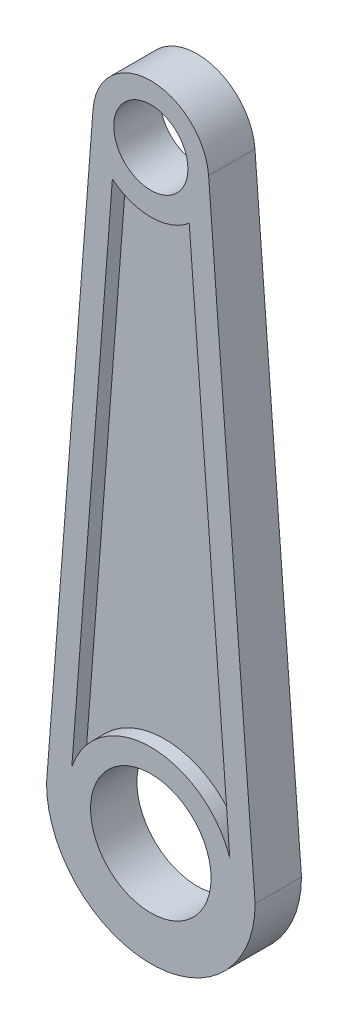
ISO-10303-21;
HEADER;
FILE_DESCRIPTION(('STEP AP214'),'2;1');
FILE_NAME('part.step','',(''),(''),'','','');
FILE_SCHEMA(('AUTOMOTIVE_DESIGN { 1 0 10303 214 1 1 1 1 }'));
ENDSEC;
DATA;
#1=APPLICATION_CONTEXT('core data for automotive mechanical design processes');
#2=APPLICATION_PROTOCOL_DEFINITION('international standard','automotive_design',2000,#1);
#3=PRODUCT_CONTEXT('',#1,'mechanical');
#4=PRODUCT('Part','Part','',(#3));
#5=PRODUCT_RELATED_PRODUCT_CATEGORY('part','',(#4));
#6=PRODUCT_DEFINITION_FORMATION('','',#4);
#7=PRODUCT_DEFINITION_CONTEXT('part definition',#1,'design');
#8=PRODUCT_DEFINITION('design','',#6,#7);
#9=PRODUCT_DEFINITION_SHAPE('','',#8);
#10=(LENGTH_UNIT() NAMED_UNIT(*) SI_UNIT(.MILLI.,.METRE.));
#11=(NAMED_UNIT(*) PLANE_ANGLE_UNIT() SI_UNIT($,.RADIAN.));
#12=(NAMED_UNIT(*) SI_UNIT($,.STERADIAN.) SOLID_ANGLE_UNIT());
#13=UNCERTAINTY_MEASURE_WITH_UNIT(LENGTH_MEASURE(1.E-05),#10,'distance_accuracy_value','');
#14=(GEOMETRIC_REPRESENTATION_CONTEXT(3) GLOBAL_UNCERTAINTY_ASSIGNED_CONTEXT((#13)) GLOBAL_UNIT_ASSIGNED_CONTEXT((#10,
#11,#12)) REPRESENTATION_CONTEXT('',''));
#15=CARTESIAN_POINT('',(0.,0.,0.));
#16=DIRECTION('',(0.,0.,1.));
#17=DIRECTION('',(1.,0.,0.));
#18=AXIS2_PLACEMENT_3D('',#15,#16,#17);
#19=CARTESIAN_POINT('',(0.,0.,-5.));
#20=DIRECTION('',(0.,0.,1.));
#21=DIRECTION('',(1.,0.,0.));
#22=AXIS2_PLACEMENT_3D('',#19,#20,#21);
#23=PLANE('',#22);
#24=CARTESIAN_POINT('',(-1.71286567030721E-05,129.999999999999,-5.));
#25=DIRECTION('',(0.,0.,1.));
#26=DIRECTION('',(1.,0.,0.));
#27=AXIS2_PLACEMENT_3D('',#24,#25,#26);
#28=CIRCLE('',#27,8.00000000000001);
#29=CARTESIAN_POINT('',(7.9999828713433,129.999999999999,-5.));
#30=VERTEX_POINT('',#29);
#31=EDGE_CURVE('E201',#30,#30,#28,.T.);
#32=ORIENTED_EDGE('',*,*,#31,.T.);
#33=EDGE_LOOP('',(#32));
#34=FACE_BOUND('',#33,.T.);
#35=CARTESIAN_POINT('',(0.,0.,-5.));
#36=DIRECTION('',(0.,0.,1.));
#37=DIRECTION('',(1.,0.,0.));
#38=AXIS2_PLACEMENT_3D('',#35,#36,#37);
#39=CIRCLE('',#38,13.);
#40=CARTESIAN_POINT('',(13.,0.,-5.));
#41=VERTEX_POINT('',#40);
#42=EDGE_CURVE('E225',#41,#41,#39,.T.);
#43=ORIENTED_EDGE('',*,*,#42,.T.);
#44=EDGE_LOOP('',(#43));
#45=FACE_BOUND('',#44,.T.);
#46=DIRECTION('',(-0.0764171204316365,0.99707593677961,0.));
#47=VECTOR('',#46,1.);
#48=CARTESIAN_POINT('',(22.3686095333611,1.71435761865842,-5.));
#49=LINE('',#48,#47);
#50=CARTESIAN_POINT('',(22.5,0.,-5.));
#51=VERTEX_POINT('',#50);
#52=CARTESIAN_POINT('',(12.4634320810884,130.955214005394,-5.));
#53=VERTEX_POINT('',#52);
#54=EDGE_CURVE('E191',#51,#53,#49,.T.);
#55=ORIENTED_EDGE('',*,*,#54,.F.);
#56=CARTESIAN_POINT('',(0.,0.,-5.));
#57=DIRECTION('',(0.,0.,1.));
#58=DIRECTION('',(1.,0.,0.));
#59=AXIS2_PLACEMENT_3D('',#56,#57,#58);
#60=CIRCLE('',#59,22.5);
#61=CARTESIAN_POINT('',(-22.5,0.,-5.));
#62=VERTEX_POINT('',#61);
#63=EDGE_CURVE('E223',#62,#51,#60,.T.);
#64=ORIENTED_EDGE('',*,*,#63,.F.);
#65=DIRECTION('',(0.0764168611240457,0.997075956653227,0.));
#66=VECTOR('',#65,1.);
#67=CARTESIAN_POINT('',(-22.3686104250588,1.71435183546813,-5.));
#68=LINE('',#67,#66);
#69=CARTESIAN_POINT('',(-12.463466586822,130.955210764049,-5.));
#70=VERTEX_POINT('',#69);
#71=EDGE_CURVE('E220',#62,#70,#68,.T.);
#72=ORIENTED_EDGE('',*,*,#71,.T.);
#73=CARTESIAN_POINT('',(-1.71286567030721E-05,129.999999999999,-5.));
#74=DIRECTION('',(0.,0.,1.));
#75=DIRECTION('',(1.,0.,0.));
#76=AXIS2_PLACEMENT_3D('',#73,#74,#75);
#77=CIRCLE('',#76,12.5);
#78=EDGE_CURVE('E217',#53,#70,#77,.T.);
#79=ORIENTED_EDGE('',*,*,#78,.F.);
#80=EDGE_LOOP('',(#55,#64,#72,#79));
#81=FACE_BOUND('',#80,.T.);
#82=CARTESIAN_POINT('',(0.,0.,-5.));
#83=DIRECTION('',(0.,0.,-1.));
#84=DIRECTION('',(1.,0.,0.));
#85=AXIS2_PLACEMENT_3D('',#82,#83,#84);
#86=CIRCLE('',#85,18.);
#87=CARTESIAN_POINT('',(-17.0410711642596,5.79671403250494,-5.));
#88=VERTEX_POINT('',#87);
#89=CARTESIAN_POINT('',(17.0410690778207,5.79672016617532,-5.));
#90=VERTEX_POINT('',#89);
#91=EDGE_CURVE('E54',#88,#90,#86,.T.);
#92=ORIENTED_EDGE('',*,*,#91,.T.);
#93=DIRECTION('',(-0.0764171204316364,0.99707593677961,0.));
#94=VECTOR('',#93,1.);
#95=CARTESIAN_POINT('',(17.0410690778207,5.79672016617532,-5.));
#96=LINE('',#95,#94);
#97=CARTESIAN_POINT('',(8.28947844266117,119.985796927707,-5.));
#98=VERTEX_POINT('',#97);
#99=EDGE_CURVE('E148',#90,#98,#96,.T.);
#100=ORIENTED_EDGE('',*,*,#99,.T.);
#101=CARTESIAN_POINT('',(-1.71286567030721E-05,129.999999999999,-5.));
#102=DIRECTION('',(0.,0.,-1.));
#103=DIRECTION('',(1.,0.,0.));
#104=AXIS2_PLACEMENT_3D('',#101,#102,#103);
#105=CIRCLE('',#104,13.);
#106=CARTESIAN_POINT('',(-8.2895100956001,119.985794771874,-5.));
#107=VERTEX_POINT('',#106);
#108=EDGE_CURVE('E151',#98,#107,#105,.T.);
#109=ORIENTED_EDGE('',*,*,#108,.T.);
#110=DIRECTION('',(-0.0764168611240456,-0.997075956653227,0.));
#111=VECTOR('',#110,1.);
#112=CARTESIAN_POINT('',(-8.2895100956001,119.985794771874,-5.));
#113=LINE('',#112,#111);
#114=EDGE_CURVE('E157',#107,#88,#113,.T.);
#115=ORIENTED_EDGE('',*,*,#114,.T.);
#116=EDGE_LOOP('',(#92,#100,#109,#115));
#117=FACE_BOUND('',#116,.T.);
#118=ADVANCED_FACE('F39',(#34,#45,#81,#117),#23,.F.);
#119=CARTESIAN_POINT('',(22.3686095333611,1.71435761865842,5.));
#120=DIRECTION('',(-0.99707593677961,-0.0764171204316365,0.));
#121=DIRECTION('',(0.0764171204316365,-0.99707593677961,0.));
#122=AXIS2_PLACEMENT_3D('',#119,#120,#121);
#123=PLANE('',#122);
#124=ORIENTED_EDGE('',*,*,#54,.T.);
#125=DIRECTION('',(0.,0.,-1.));
#126=VECTOR('',#125,1.);
#127=CARTESIAN_POINT('',(12.4634320810884,130.955214005394,5.));
#128=LINE('',#127,#126);
#129=CARTESIAN_POINT('',(12.4634320810884,130.955214005394,5.));
#130=VERTEX_POINT('',#129);
#131=EDGE_CURVE('E11',#130,#53,#128,.T.);
#132=ORIENTED_EDGE('',*,*,#131,.F.);
#133=DIRECTION('',(-0.0764171204316365,0.99707593677961,0.));
#134=VECTOR('',#133,1.);
#135=CARTESIAN_POINT('',(22.3686095333611,1.71435761865842,5.));
#136=LINE('',#135,#134);
#137=CARTESIAN_POINT('',(22.5,0.,5.));
#138=VERTEX_POINT('',#137);
#139=EDGE_CURVE('E197',#138,#130,#136,.T.);
#140=ORIENTED_EDGE('',*,*,#139,.F.);
#141=DIRECTION('',(0.,0.,-1.));
#142=VECTOR('',#141,1.);
#143=CARTESIAN_POINT('',(22.5,0.,5.));
#144=LINE('',#143,#142);
#145=EDGE_CURVE('E214',#138,#51,#144,.T.);
#146=ORIENTED_EDGE('',*,*,#145,.T.);
#147=EDGE_LOOP('',(#124,#132,#140,#146));
#148=FACE_BOUND('',#147,.T.);
#149=ADVANCED_FACE('F41',(#148),#123,.F.);
#150=CARTESIAN_POINT('',(-1.71286567030721E-05,129.999999999999,5.));
#151=DIRECTION('',(0.,0.,-1.));
#152=DIRECTION('',(-1.,0.,0.));
#153=AXIS2_PLACEMENT_3D('',#150,#151,#152);
#154=CYLINDRICAL_SURFACE('',#153,12.5);
#155=ORIENTED_EDGE('',*,*,#78,.T.);
#156=DIRECTION('',(0.,0.,-1.));
#157=VECTOR('',#156,1.);
#158=CARTESIAN_POINT('',(-12.463466586822,130.955210764049,5.));
#159=LINE('',#158,#157);
#160=CARTESIAN_POINT('',(-12.463466586822,130.955210764049,5.));
#161=VERTEX_POINT('',#160);
#162=EDGE_CURVE('E47',#161,#70,#159,.T.);
#163=ORIENTED_EDGE('',*,*,#162,.F.);
#164=CARTESIAN_POINT('',(-1.71286567030721E-05,129.999999999999,5.));
#165=DIRECTION('',(0.,0.,1.));
#166=DIRECTION('',(1.,0.,0.));
#167=AXIS2_PLACEMENT_3D('',#164,#165,#166);
#168=CIRCLE('',#167,12.5);
#169=EDGE_CURVE('E200',#130,#161,#168,.T.);
#170=ORIENTED_EDGE('',*,*,#169,.F.);
#171=ORIENTED_EDGE('',*,*,#131,.T.);
#172=EDGE_LOOP('',(#155,#163,#170,#171));
#173=FACE_BOUND('',#172,.T.);
#174=ADVANCED_FACE('F239',(#173),#154,.T.);
#175=CARTESIAN_POINT('',(-22.3686104250588,1.71435183546813,5.));
#176=DIRECTION('',(-0.997075956653227,0.0764168611240457,0.));
#177=DIRECTION('',(-0.0764168611240457,-0.997075956653227,0.));
#178=AXIS2_PLACEMENT_3D('',#175,#176,#177);
#179=PLANE('',#178);
#180=ORIENTED_EDGE('',*,*,#71,.F.);
#181=DIRECTION('',(0.,0.,-1.));
#182=VECTOR('',#181,1.);
#183=CARTESIAN_POINT('',(-22.5,0.,5.));
#184=LINE('',#183,#182);
#185=CARTESIAN_POINT('',(-22.5,0.,5.));
#186=VERTEX_POINT('',#185);
#187=EDGE_CURVE('E232',#186,#62,#184,.T.);
#188=ORIENTED_EDGE('',*,*,#187,.F.);
#189=DIRECTION('',(0.0764168611240457,0.997075956653227,0.));
#190=VECTOR('',#189,1.);
#191=CARTESIAN_POINT('',(-22.3686104250588,1.71435183546813,5.));
#192=LINE('',#191,#190);
#193=EDGE_CURVE('E203',#186,#161,#192,.T.);
#194=ORIENTED_EDGE('',*,*,#193,.T.);
#195=ORIENTED_EDGE('',*,*,#162,.T.);
#196=EDGE_LOOP('',(#180,#188,#194,#195));
#197=FACE_BOUND('',#196,.T.);
#198=ADVANCED_FACE('F236',(#197),#179,.T.);
#199=CARTESIAN_POINT('',(0.,0.,5.));
#200=DIRECTION('',(0.,0.,-1.));
#201=DIRECTION('',(-1.,0.,0.));
#202=AXIS2_PLACEMENT_3D('',#199,#200,#201);
#203=CYLINDRICAL_SURFACE('',#202,13.);
#204=CARTESIAN_POINT('',(0.,0.,5.));
#205=DIRECTION('',(0.,0.,1.));
#206=DIRECTION('',(1.,0.,0.));
#207=AXIS2_PLACEMENT_3D('',#204,#205,#206);
#208=CIRCLE('',#207,13.);
#209=CARTESIAN_POINT('',(13.,0.,5.));
#210=VERTEX_POINT('',#209);
#211=EDGE_CURVE('E208',#210,#210,#208,.T.);
#212=ORIENTED_EDGE('',*,*,#211,.T.);
#213=EDGE_LOOP('',(#212));
#214=FACE_BOUND('',#213,.T.);
#215=ORIENTED_EDGE('',*,*,#42,.F.);
#216=EDGE_LOOP('',(#215));
#217=FACE_BOUND('',#216,.T.);
#218=ADVANCED_FACE('F273',(#214,#217),#203,.F.);
#219=CARTESIAN_POINT('',(0.,0.,5.));
#220=DIRECTION('',(0.,0.,-1.));
#221=DIRECTION('',(-1.,0.,0.));
#222=AXIS2_PLACEMENT_3D('',#219,#220,#221);
#223=CYLINDRICAL_SURFACE('',#222,22.5);
#224=ORIENTED_EDGE('',*,*,#63,.T.);
#225=ORIENTED_EDGE('',*,*,#145,.F.);
#226=CARTESIAN_POINT('',(0.,0.,5.));
#227=DIRECTION('',(0.,0.,1.));
#228=DIRECTION('',(1.,0.,0.));
#229=AXIS2_PLACEMENT_3D('',#226,#227,#228);
#230=CIRCLE('',#229,22.5);
#231=EDGE_CURVE('E206',#186,#138,#230,.T.);
#232=ORIENTED_EDGE('',*,*,#231,.F.);
#233=ORIENTED_EDGE('',*,*,#187,.T.);
#234=EDGE_LOOP('',(#224,#225,#232,#233));
#235=FACE_BOUND('',#234,.T.);
#236=ADVANCED_FACE('F247',(#235),#223,.T.);
#237=CARTESIAN_POINT('',(-1.71286567030721E-05,129.999999999999,5.));
#238=DIRECTION('',(0.,0.,-1.));
#239=DIRECTION('',(-1.,0.,0.));
#240=AXIS2_PLACEMENT_3D('',#237,#238,#239);
#241=CYLINDRICAL_SURFACE('',#240,8.00000000000001);
#242=CARTESIAN_POINT('',(-1.71286567030721E-05,129.999999999999,5.));
#243=DIRECTION('',(0.,0.,1.));
#244=DIRECTION('',(1.,0.,0.));
#245=AXIS2_PLACEMENT_3D('',#242,#243,#244);
#246=CIRCLE('',#245,8.00000000000001);
#247=CARTESIAN_POINT('',(7.9999828713433,129.999999999999,5.));
#248=VERTEX_POINT('',#247);
#249=EDGE_CURVE('E211',#248,#248,#246,.T.);
#250=ORIENTED_EDGE('',*,*,#249,.T.);
#251=EDGE_LOOP('',(#250));
#252=FACE_BOUND('',#251,.T.);
#253=ORIENTED_EDGE('',*,*,#31,.F.);
#254=EDGE_LOOP('',(#253));
#255=FACE_BOUND('',#254,.T.);
#256=ADVANCED_FACE('F256',(#252,#255),#241,.F.);
#257=CARTESIAN_POINT('',(0.,0.,5.));
#258=DIRECTION('',(0.,0.,1.));
#259=DIRECTION('',(1.,0.,0.));
#260=AXIS2_PLACEMENT_3D('',#257,#258,#259);
#261=PLANE('',#260);
#262=CARTESIAN_POINT('',(0.,0.,5.));
#263=DIRECTION('',(0.,0.,-1.));
#264=DIRECTION('',(1.,0.,0.));
#265=AXIS2_PLACEMENT_3D('',#262,#263,#264);
#266=CIRCLE('',#265,18.);
#267=CARTESIAN_POINT('',(-17.0410711642596,5.79671403250494,5.));
#268=VERTEX_POINT('',#267);
#269=CARTESIAN_POINT('',(17.0410690778207,5.79672016617532,5.));
#270=VERTEX_POINT('',#269);
#271=EDGE_CURVE('E62',#268,#270,#266,.T.);
#272=ORIENTED_EDGE('',*,*,#271,.F.);
#273=DIRECTION('',(-0.0764168611240456,-0.997075956653227,0.));
#274=VECTOR('',#273,1.);
#275=CARTESIAN_POINT('',(-8.2895100956001,119.985794771874,5.));
#276=LINE('',#275,#274);
#277=CARTESIAN_POINT('',(-8.2895100956001,119.985794771874,5.));
#278=VERTEX_POINT('',#277);
#279=EDGE_CURVE('E170',#278,#268,#276,.T.);
#280=ORIENTED_EDGE('',*,*,#279,.F.);
#281=CARTESIAN_POINT('',(-1.71286567030721E-05,129.999999999999,5.));
#282=DIRECTION('',(0.,0.,-1.));
#283=DIRECTION('',(1.,0.,0.));
#284=AXIS2_PLACEMENT_3D('',#281,#282,#283);
#285=CIRCLE('',#284,13.);
#286=CARTESIAN_POINT('',(8.28947844266117,119.985796927707,5.));
#287=VERTEX_POINT('',#286);
#288=EDGE_CURVE('E184',#287,#278,#285,.T.);
#289=ORIENTED_EDGE('',*,*,#288,.F.);
#290=DIRECTION('',(-0.0764171204316364,0.99707593677961,0.));
#291=VECTOR('',#290,1.);
#292=CARTESIAN_POINT('',(17.0410690778207,5.79672016617532,5.));
#293=LINE('',#292,#291);
#294=EDGE_CURVE('E181',#270,#287,#293,.T.);
#295=ORIENTED_EDGE('',*,*,#294,.F.);
#296=EDGE_LOOP('',(#272,#280,#289,#295));
#297=FACE_BOUND('',#296,.T.);
#298=ORIENTED_EDGE('',*,*,#139,.T.);
#299=ORIENTED_EDGE('',*,*,#169,.T.);
#300=ORIENTED_EDGE('',*,*,#193,.F.);
#301=ORIENTED_EDGE('',*,*,#231,.T.);
#302=EDGE_LOOP('',(#298,#299,#300,#301));
#303=FACE_BOUND('',#302,.T.);
#304=ORIENTED_EDGE('',*,*,#211,.F.);
#305=EDGE_LOOP('',(#304));
#306=FACE_BOUND('',#305,.T.);
#307=ORIENTED_EDGE('',*,*,#249,.F.);
#308=EDGE_LOOP('',(#307));
#309=FACE_BOUND('',#308,.T.);
#310=ADVANCED_FACE('F252',(#297,#303,#306,#309),#261,.T.);
#311=CARTESIAN_POINT('',(0.,0.,2.));
#312=DIRECTION('',(0.,0.,1.));
#313=DIRECTION('',(1.,0.,0.));
#314=AXIS2_PLACEMENT_3D('',#311,#312,#313);
#315=CYLINDRICAL_SURFACE('',#314,18.);
#316=ORIENTED_EDGE('',*,*,#271,.T.);
#317=DIRECTION('',(0.,0.,1.));
#318=VECTOR('',#317,1.);
#319=CARTESIAN_POINT('',(17.0410690778207,5.79672016617532,2.));
#320=LINE('',#319,#318);
#321=CARTESIAN_POINT('',(17.0410690778207,5.79672016617532,2.));
#322=VERTEX_POINT('',#321);
#323=EDGE_CURVE('E179',#322,#270,#320,.T.);
#324=ORIENTED_EDGE('',*,*,#323,.F.);
#325=CARTESIAN_POINT('',(0.,0.,2.));
#326=DIRECTION('',(0.,0.,-1.));
#327=DIRECTION('',(1.,0.,0.));
#328=AXIS2_PLACEMENT_3D('',#325,#326,#327);
#329=CIRCLE('',#328,18.);
#330=CARTESIAN_POINT('',(-17.0410711642596,5.79671403250494,2.));
#331=VERTEX_POINT('',#330);
#332=EDGE_CURVE('E166',#331,#322,#329,.T.);
#333=ORIENTED_EDGE('',*,*,#332,.F.);
#334=DIRECTION('',(0.,0.,1.));
#335=VECTOR('',#334,1.);
#336=CARTESIAN_POINT('',(-17.0410711642596,5.79671403250494,2.));
#337=LINE('',#336,#335);
#338=EDGE_CURVE('E189',#331,#268,#337,.T.);
#339=ORIENTED_EDGE('',*,*,#338,.T.);
#340=EDGE_LOOP('',(#316,#324,#333,#339));
#341=FACE_BOUND('',#340,.T.);
#342=ADVANCED_FACE('F255',(#341),#315,.T.);
#343=CARTESIAN_POINT('',(-8.2895100956001,119.985794771874,2.));
#344=DIRECTION('',(-0.997075956653227,0.0764168611240456,0.));
#345=DIRECTION('',(-0.0764168611240456,-0.997075956653227,0.));
#346=AXIS2_PLACEMENT_3D('',#343,#344,#345);
#347=PLANE('',#346);
#348=ORIENTED_EDGE('',*,*,#279,.T.);
#349=ORIENTED_EDGE('',*,*,#338,.F.);
#350=DIRECTION('',(-0.0764168611240456,-0.997075956653227,0.));
#351=VECTOR('',#350,1.);
#352=CARTESIAN_POINT('',(-8.2895100956001,119.985794771874,2.));
#353=LINE('',#352,#351);
#354=CARTESIAN_POINT('',(-8.2895100956001,119.985794771874,2.));
#355=VERTEX_POINT('',#354);
#356=EDGE_CURVE('E176',#355,#331,#353,.T.);
#357=ORIENTED_EDGE('',*,*,#356,.F.);
#358=DIRECTION('',(0.,0.,1.));
#359=VECTOR('',#358,1.);
#360=CARTESIAN_POINT('',(-8.2895100956001,119.985794771874,2.));
#361=LINE('',#360,#359);
#362=EDGE_CURVE('E192',#355,#278,#361,.T.);
#363=ORIENTED_EDGE('',*,*,#362,.T.);
#364=EDGE_LOOP('',(#348,#349,#357,#363));
#365=FACE_BOUND('',#364,.T.);
#366=ADVANCED_FACE('F362',(#365),#347,.F.);
#367=CARTESIAN_POINT('',(-1.71286567030721E-05,129.999999999999,2.));
#368=DIRECTION('',(0.,0.,1.));
#369=DIRECTION('',(1.,0.,0.));
#370=AXIS2_PLACEMENT_3D('',#367,#368,#369);
#371=CYLINDRICAL_SURFACE('',#370,13.);
#372=ORIENTED_EDGE('',*,*,#288,.T.);
#373=ORIENTED_EDGE('',*,*,#362,.F.);
#374=CARTESIAN_POINT('',(-1.71286567030721E-05,129.999999999999,2.));
#375=DIRECTION('',(0.,0.,-1.));
#376=DIRECTION('',(1.,0.,0.));
#377=AXIS2_PLACEMENT_3D('',#374,#375,#376);
#378=CIRCLE('',#377,13.);
#379=CARTESIAN_POINT('',(8.28947844266117,119.985796927707,2.));
#380=VERTEX_POINT('',#379);
#381=EDGE_CURVE('E173',#380,#355,#378,.T.);
#382=ORIENTED_EDGE('',*,*,#381,.F.);
#383=DIRECTION('',(0.,0.,1.));
#384=VECTOR('',#383,1.);
#385=CARTESIAN_POINT('',(8.28947844266117,119.985796927707,2.));
#386=LINE('',#385,#384);
#387=EDGE_CURVE('E194',#380,#287,#386,.T.);
#388=ORIENTED_EDGE('',*,*,#387,.T.);
#389=EDGE_LOOP('',(#372,#373,#382,#388));
#390=FACE_BOUND('',#389,.T.);
#391=ADVANCED_FACE('F365',(#390),#371,.T.);
#392=CARTESIAN_POINT('',(17.0410690778207,5.79672016617532,2.));
#393=DIRECTION('',(0.99707593677961,0.0764171204316364,0.));
#394=DIRECTION('',(-0.0764171204316364,0.99707593677961,0.));
#395=AXIS2_PLACEMENT_3D('',#392,#393,#394);
#396=PLANE('',#395);
#397=ORIENTED_EDGE('',*,*,#294,.T.);
#398=ORIENTED_EDGE('',*,*,#387,.F.);
#399=DIRECTION('',(-0.0764171204316364,0.99707593677961,0.));
#400=VECTOR('',#399,1.);
#401=CARTESIAN_POINT('',(17.0410690778207,5.79672016617532,2.));
#402=LINE('',#401,#400);
#403=EDGE_CURVE('E169',#322,#380,#402,.T.);
#404=ORIENTED_EDGE('',*,*,#403,.F.);
#405=ORIENTED_EDGE('',*,*,#323,.T.);
#406=EDGE_LOOP('',(#397,#398,#404,#405));
#407=FACE_BOUND('',#406,.T.);
#408=ADVANCED_FACE('F360',(#407),#396,.F.);
#409=CARTESIAN_POINT('',(0.,0.,2.));
#410=DIRECTION('',(0.,0.,1.));
#411=DIRECTION('',(1.,0.,0.));
#412=AXIS2_PLACEMENT_3D('',#409,#410,#411);
#413=PLANE('',#412);
#414=ORIENTED_EDGE('',*,*,#332,.T.);
#415=ORIENTED_EDGE('',*,*,#403,.T.);
#416=ORIENTED_EDGE('',*,*,#381,.T.);
#417=ORIENTED_EDGE('',*,*,#356,.T.);
#418=EDGE_LOOP('',(#414,#415,#416,#417));
#419=FACE_BOUND('',#418,.T.);
#420=ADVANCED_FACE('F301',(#419),#413,.T.);
#421=CARTESIAN_POINT('',(0.,0.,-2.));
#422=DIRECTION('',(0.,0.,-1.));
#423=DIRECTION('',(-1.,0.,0.));
#424=AXIS2_PLACEMENT_3D('',#421,#422,#423);
#425=CYLINDRICAL_SURFACE('',#424,18.);
#426=ORIENTED_EDGE('',*,*,#91,.F.);
#427=DIRECTION('',(0.,0.,-1.));
#428=VECTOR('',#427,1.);
#429=CARTESIAN_POINT('',(-17.0410711642596,5.79671403250494,-2.));
#430=LINE('',#429,#428);
#431=CARTESIAN_POINT('',(-17.0410711642596,5.79671403250494,-2.));
#432=VERTEX_POINT('',#431);
#433=EDGE_CURVE('E133',#432,#88,#430,.T.);
#434=ORIENTED_EDGE('',*,*,#433,.F.);
#435=CARTESIAN_POINT('',(0.,0.,-2.));
#436=DIRECTION('',(0.,0.,-1.));
#437=DIRECTION('',(1.,0.,0.));
#438=AXIS2_PLACEMENT_3D('',#435,#436,#437);
#439=CIRCLE('',#438,18.);
#440=CARTESIAN_POINT('',(17.0410690778207,5.79672016617532,-2.));
#441=VERTEX_POINT('',#440);
#442=EDGE_CURVE('E140',#432,#441,#439,.T.);
#443=ORIENTED_EDGE('',*,*,#442,.T.);
#444=DIRECTION('',(0.,0.,-1.));
#445=VECTOR('',#444,1.);
#446=CARTESIAN_POINT('',(17.0410690778207,5.79672016617532,-2.));
#447=LINE('',#446,#445);
#448=EDGE_CURVE('E161',#441,#90,#447,.T.);
#449=ORIENTED_EDGE('',*,*,#448,.T.);
#450=EDGE_LOOP('',(#426,#434,#443,#449));
#451=FACE_BOUND('',#450,.T.);
#452=ADVANCED_FACE('F143',(#451),#425,.T.);
#453=CARTESIAN_POINT('',(17.0410690778207,5.79672016617532,-2.));
#454=DIRECTION('',(-0.99707593677961,-0.0764171204316364,0.));
#455=DIRECTION('',(0.0764171204316364,-0.99707593677961,0.));
#456=AXIS2_PLACEMENT_3D('',#453,#454,#455);
#457=PLANE('',#456);
#458=ORIENTED_EDGE('',*,*,#99,.F.);
#459=ORIENTED_EDGE('',*,*,#448,.F.);
#460=DIRECTION('',(-0.0764171204316364,0.99707593677961,0.));
#461=VECTOR('',#460,1.);
#462=CARTESIAN_POINT('',(17.0410690778207,5.79672016617532,-2.));
#463=LINE('',#462,#461);
#464=CARTESIAN_POINT('',(8.28947844266117,119.985796927707,-2.));
#465=VERTEX_POINT('',#464);
#466=EDGE_CURVE('E145',#441,#465,#463,.T.);
#467=ORIENTED_EDGE('',*,*,#466,.T.);
#468=DIRECTION('',(0.,0.,-1.));
#469=VECTOR('',#468,1.);
#470=CARTESIAN_POINT('',(8.28947844266117,119.985796927707,-2.));
#471=LINE('',#470,#469);
#472=EDGE_CURVE('E163',#465,#98,#471,.T.);
#473=ORIENTED_EDGE('',*,*,#472,.T.);
#474=EDGE_LOOP('',(#458,#459,#467,#473));
#475=FACE_BOUND('',#474,.T.);
#476=ADVANCED_FACE('F310',(#475),#457,.T.);
#477=CARTESIAN_POINT('',(-1.71286567030721E-05,129.999999999999,-2.));
#478=DIRECTION('',(0.,0.,-1.));
#479=DIRECTION('',(-1.,0.,0.));
#480=AXIS2_PLACEMENT_3D('',#477,#478,#479);
#481=CYLINDRICAL_SURFACE('',#480,13.);
#482=ORIENTED_EDGE('',*,*,#108,.F.);
#483=ORIENTED_EDGE('',*,*,#472,.F.);
#484=CARTESIAN_POINT('',(-1.71286567030721E-05,129.999999999999,-2.));
#485=DIRECTION('',(0.,0.,-1.));
#486=DIRECTION('',(1.,0.,0.));
#487=AXIS2_PLACEMENT_3D('',#484,#485,#486);
#488=CIRCLE('',#487,13.);
#489=CARTESIAN_POINT('',(-8.2895100956001,119.985794771874,-2.));
#490=VERTEX_POINT('',#489);
#491=EDGE_CURVE('E139',#465,#490,#488,.T.);
#492=ORIENTED_EDGE('',*,*,#491,.T.);
#493=DIRECTION('',(0.,0.,-1.));
#494=VECTOR('',#493,1.);
#495=CARTESIAN_POINT('',(-8.2895100956001,119.985794771874,-2.));
#496=LINE('',#495,#494);
#497=EDGE_CURVE('E135',#490,#107,#496,.T.);
#498=ORIENTED_EDGE('',*,*,#497,.T.);
#499=EDGE_LOOP('',(#482,#483,#492,#498));
#500=FACE_BOUND('',#499,.T.);
#501=ADVANCED_FACE('F319',(#500),#481,.T.);
#502=CARTESIAN_POINT('',(-8.2895100956001,119.985794771874,-2.));
#503=DIRECTION('',(0.997075956653227,-0.0764168611240456,0.));
#504=DIRECTION('',(0.0764168611240456,0.997075956653227,0.));
#505=AXIS2_PLACEMENT_3D('',#502,#503,#504);
#506=PLANE('',#505);
#507=ORIENTED_EDGE('',*,*,#114,.F.);
#508=ORIENTED_EDGE('',*,*,#497,.F.);
#509=DIRECTION('',(-0.0764168611240456,-0.997075956653227,0.));
#510=VECTOR('',#509,1.);
#511=CARTESIAN_POINT('',(-8.2895100956001,119.985794771874,-2.));
#512=LINE('',#511,#510);
#513=EDGE_CURVE('E130',#490,#432,#512,.T.);
#514=ORIENTED_EDGE('',*,*,#513,.T.);
#515=ORIENTED_EDGE('',*,*,#433,.T.);
#516=EDGE_LOOP('',(#507,#508,#514,#515));
#517=FACE_BOUND('',#516,.T.);
#518=ADVANCED_FACE('F132',(#517),#506,.T.);
#519=CARTESIAN_POINT('',(0.,0.,-2.));
#520=DIRECTION('',(0.,0.,-1.));
#521=DIRECTION('',(1.,0.,0.));
#522=AXIS2_PLACEMENT_3D('',#519,#520,#521);
#523=PLANE('',#522);
#524=ORIENTED_EDGE('',*,*,#442,.F.);
#525=ORIENTED_EDGE('',*,*,#513,.F.);
#526=ORIENTED_EDGE('',*,*,#491,.F.);
#527=ORIENTED_EDGE('',*,*,#466,.F.);
#528=EDGE_LOOP('',(#524,#525,#526,#527));
#529=FACE_BOUND('',#528,.T.);
#530=ADVANCED_FACE('F147',(#529),#523,.T.);
#531=CLOSED_SHELL('',(#118,#149,#174,#198,#218,#236,#256,#310,#342,#366,#391,#408,#420,#452,
#476,#501,#518,#530));
#532=MANIFOLD_SOLID_BREP('B2',#531);
#533=ADVANCED_BREP_SHAPE_REPRESENTATION('',(#18,#532),#14);
#534=SHAPE_DEFINITION_REPRESENTATION(#9,#533);
ENDSEC;
END-ISO-10303-21;
